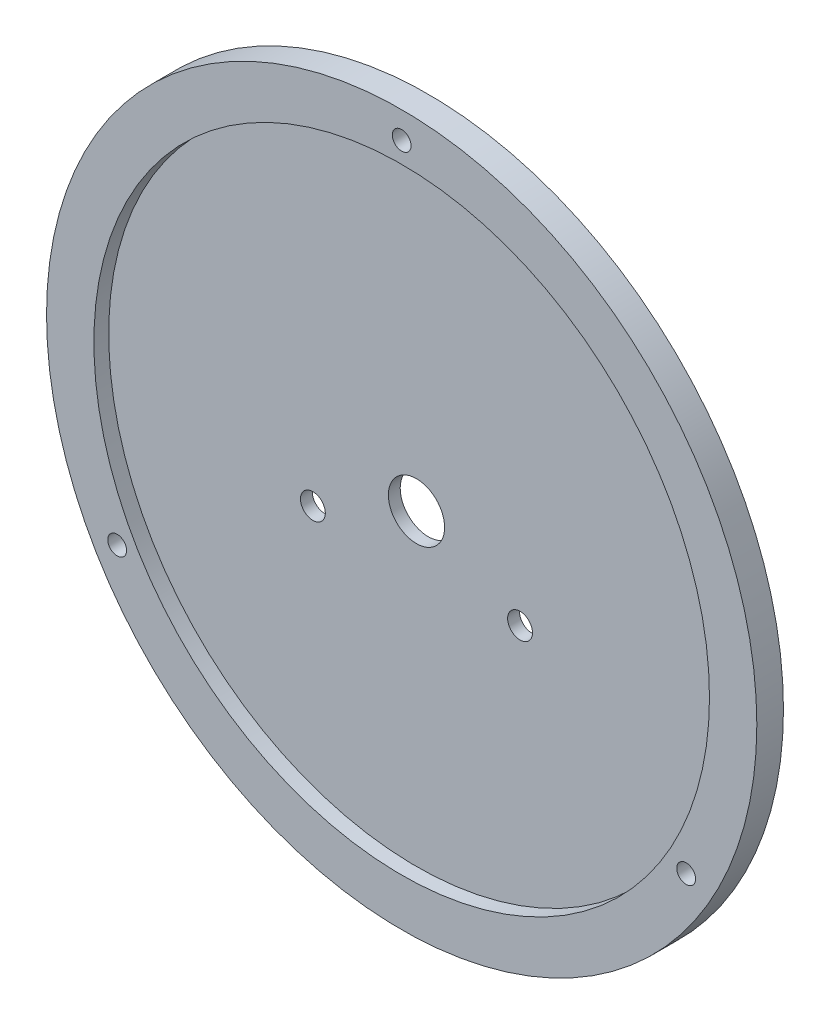
ISO-10303-21;
HEADER;
FILE_DESCRIPTION(('STEP AP214'),'2;1');
FILE_NAME('part.step','',(''),(''),'','','');
FILE_SCHEMA(('AUTOMOTIVE_DESIGN { 1 0 10303 214 1 1 1 1 }'));
ENDSEC;
DATA;
#1=APPLICATION_CONTEXT('core data for automotive mechanical design processes');
#2=APPLICATION_PROTOCOL_DEFINITION('international standard','automotive_design',2000,#1);
#3=PRODUCT_CONTEXT('',#1,'mechanical');
#4=PRODUCT('Part','Part','',(#3));
#5=PRODUCT_RELATED_PRODUCT_CATEGORY('part','',(#4));
#6=PRODUCT_DEFINITION_FORMATION('','',#4);
#7=PRODUCT_DEFINITION_CONTEXT('part definition',#1,'design');
#8=PRODUCT_DEFINITION('design','',#6,#7);
#9=PRODUCT_DEFINITION_SHAPE('','',#8);
#10=(LENGTH_UNIT() NAMED_UNIT(*) SI_UNIT(.MILLI.,.METRE.));
#11=(NAMED_UNIT(*) PLANE_ANGLE_UNIT() SI_UNIT($,.RADIAN.));
#12=(NAMED_UNIT(*) SI_UNIT($,.STERADIAN.) SOLID_ANGLE_UNIT());
#13=UNCERTAINTY_MEASURE_WITH_UNIT(LENGTH_MEASURE(1.E-05),#10,'distance_accuracy_value','');
#14=(GEOMETRIC_REPRESENTATION_CONTEXT(3) GLOBAL_UNCERTAINTY_ASSIGNED_CONTEXT((#13)) GLOBAL_UNIT_ASSIGNED_CONTEXT((#10,
#11,#12)) REPRESENTATION_CONTEXT('',''));
#15=CARTESIAN_POINT('',(0.,0.,0.));
#16=DIRECTION('',(0.,0.,1.));
#17=DIRECTION('',(1.,0.,0.));
#18=AXIS2_PLACEMENT_3D('',#15,#16,#17);
#19=CARTESIAN_POINT('',(0.,0.,2.));
#20=DIRECTION('',(0.,0.,-1.));
#21=DIRECTION('',(-1.,0.,0.));
#22=AXIS2_PLACEMENT_3D('',#19,#20,#21);
#23=CYLINDRICAL_SURFACE('',#22,60.);
#24=CARTESIAN_POINT('',(0.,0.,0.));
#25=DIRECTION('',(0.,0.,1.));
#26=DIRECTION('',(1.,0.,0.));
#27=AXIS2_PLACEMENT_3D('',#24,#25,#26);
#28=CIRCLE('',#27,60.);
#29=CARTESIAN_POINT('',(60.,0.,0.));
#30=VERTEX_POINT('',#29);
#31=EDGE_CURVE('E45',#30,#30,#28,.T.);
#32=ORIENTED_EDGE('',*,*,#31,.T.);
#33=EDGE_LOOP('',(#32));
#34=FACE_BOUND('',#33,.T.);
#35=CARTESIAN_POINT('',(0.,0.,4.5));
#36=DIRECTION('',(0.,0.,1.));
#37=DIRECTION('',(1.,0.,0.));
#38=AXIS2_PLACEMENT_3D('',#35,#36,#37);
#39=CIRCLE('',#38,60.);
#40=CARTESIAN_POINT('',(60.,0.,4.5));
#41=VERTEX_POINT('',#40);
#42=EDGE_CURVE('E51',#41,#41,#39,.T.);
#43=ORIENTED_EDGE('',*,*,#42,.F.);
#44=EDGE_LOOP('',(#43));
#45=FACE_BOUND('',#44,.T.);
#46=ADVANCED_FACE('F37',(#34,#45),#23,.T.);
#47=CARTESIAN_POINT('',(0.,0.,0.));
#48=DIRECTION('',(0.,0.,1.));
#49=DIRECTION('',(1.,0.,0.));
#50=AXIS2_PLACEMENT_3D('',#47,#48,#49);
#51=PLANE('',#50);
#52=CARTESIAN_POINT('',(17.5000000000001,-7.99999999999812,0.));
#53=DIRECTION('',(0.,0.,-1.));
#54=DIRECTION('',(-1.,0.,0.));
#55=AXIS2_PLACEMENT_3D('',#52,#53,#54);
#56=CIRCLE('',#55,2.1);
#57=CARTESIAN_POINT('',(15.4000000000001,-7.99999999999812,0.));
#58=VERTEX_POINT('',#57);
#59=EDGE_CURVE('E63',#58,#58,#56,.T.);
#60=ORIENTED_EDGE('',*,*,#59,.F.);
#61=EDGE_LOOP('',(#60));
#62=FACE_BOUND('',#61,.T.);
#63=CARTESIAN_POINT('',(-17.4999999999999,-7.99999999999812,0.));
#64=DIRECTION('',(0.,0.,-1.));
#65=DIRECTION('',(-1.,0.,0.));
#66=AXIS2_PLACEMENT_3D('',#63,#64,#65);
#67=CIRCLE('',#66,2.1);
#68=CARTESIAN_POINT('',(-19.5999999999999,-7.99999999999812,0.));
#69=VERTEX_POINT('',#68);
#70=EDGE_CURVE('E70',#69,#69,#67,.T.);
#71=ORIENTED_EDGE('',*,*,#70,.F.);
#72=EDGE_LOOP('',(#71));
#73=FACE_BOUND('',#72,.T.);
#74=CARTESIAN_POINT('',(0.,0.,0.));
#75=DIRECTION('',(0.,0.,-1.));
#76=DIRECTION('',(-1.,0.,0.));
#77=AXIS2_PLACEMENT_3D('',#74,#75,#76);
#78=CIRCLE('',#77,4.75);
#79=CARTESIAN_POINT('',(-4.75,0.,0.));
#80=VERTEX_POINT('',#79);
#81=EDGE_CURVE('E59',#80,#80,#78,.T.);
#82=ORIENTED_EDGE('',*,*,#81,.F.);
#83=EDGE_LOOP('',(#82));
#84=FACE_BOUND('',#83,.T.);
#85=CARTESIAN_POINT('',(0.,55.5,0.));
#86=DIRECTION('',(0.,0.,1.));
#87=DIRECTION('',(1.,0.,0.));
#88=AXIS2_PLACEMENT_3D('',#85,#86,#87);
#89=CIRCLE('',#88,1.5875);
#90=CARTESIAN_POINT('',(1.5875,55.5,0.));
#91=VERTEX_POINT('',#90);
#92=EDGE_CURVE('E81',#91,#91,#89,.T.);
#93=ORIENTED_EDGE('',*,*,#92,.T.);
#94=EDGE_LOOP('',(#93));
#95=FACE_BOUND('',#94,.T.);
#96=CARTESIAN_POINT('',(48.0644099100387,-27.7499999999986,0.));
#97=DIRECTION('',(0.,0.,1.));
#98=DIRECTION('',(1.,0.,0.));
#99=AXIS2_PLACEMENT_3D('',#96,#97,#98);
#100=CIRCLE('',#99,1.58750000000211);
#101=CARTESIAN_POINT('',(49.6519099100408,-27.7499999999986,0.));
#102=VERTEX_POINT('',#101);
#103=EDGE_CURVE('E90',#102,#102,#100,.T.);
#104=ORIENTED_EDGE('',*,*,#103,.T.);
#105=EDGE_LOOP('',(#104));
#106=FACE_BOUND('',#105,.T.);
#107=CARTESIAN_POINT('',(-48.064409910034,-27.7500000000014,0.));
#108=DIRECTION('',(0.,0.,1.));
#109=DIRECTION('',(1.,0.,0.));
#110=AXIS2_PLACEMENT_3D('',#107,#108,#109);
#111=CIRCLE('',#110,1.58750000000316);
#112=CARTESIAN_POINT('',(-46.4769099100308,-27.7500000000014,0.));
#113=VERTEX_POINT('',#112);
#114=EDGE_CURVE('E98',#113,#113,#111,.T.);
#115=ORIENTED_EDGE('',*,*,#114,.T.);
#116=EDGE_LOOP('',(#115));
#117=FACE_BOUND('',#116,.T.);
#118=ORIENTED_EDGE('',*,*,#31,.F.);
#119=EDGE_LOOP('',(#118));
#120=FACE_BOUND('',#119,.T.);
#121=ADVANCED_FACE('F115',(#62,#73,#84,#95,#106,#117,#120),#51,.F.);
#122=CARTESIAN_POINT('',(0.,0.,4.5));
#123=DIRECTION('',(0.,0.,1.));
#124=DIRECTION('',(1.,0.,0.));
#125=AXIS2_PLACEMENT_3D('',#122,#123,#124);
#126=PLANE('',#125);
#127=CARTESIAN_POINT('',(0.,55.5,4.5));
#128=DIRECTION('',(0.,0.,1.));
#129=DIRECTION('',(1.,0.,0.));
#130=AXIS2_PLACEMENT_3D('',#127,#128,#129);
#131=CIRCLE('',#130,1.5875);
#132=CARTESIAN_POINT('',(1.5875,55.5,4.5));
#133=VERTEX_POINT('',#132);
#134=EDGE_CURVE('E86',#133,#133,#131,.T.);
#135=ORIENTED_EDGE('',*,*,#134,.F.);
#136=EDGE_LOOP('',(#135));
#137=FACE_BOUND('',#136,.T.);
#138=CARTESIAN_POINT('',(48.0644099100387,-27.7499999999986,4.5));
#139=DIRECTION('',(0.,0.,1.));
#140=DIRECTION('',(1.,0.,0.));
#141=AXIS2_PLACEMENT_3D('',#138,#139,#140);
#142=CIRCLE('',#141,1.58750000000211);
#143=CARTESIAN_POINT('',(49.6519099100408,-27.7499999999986,4.5));
#144=VERTEX_POINT('',#143);
#145=EDGE_CURVE('E94',#144,#144,#142,.T.);
#146=ORIENTED_EDGE('',*,*,#145,.F.);
#147=EDGE_LOOP('',(#146));
#148=FACE_BOUND('',#147,.T.);
#149=CARTESIAN_POINT('',(-48.064409910034,-27.7500000000014,4.5));
#150=DIRECTION('',(0.,0.,1.));
#151=DIRECTION('',(1.,0.,0.));
#152=AXIS2_PLACEMENT_3D('',#149,#150,#151);
#153=CIRCLE('',#152,1.58750000000316);
#154=CARTESIAN_POINT('',(-46.4769099100308,-27.7500000000014,4.5));
#155=VERTEX_POINT('',#154);
#156=EDGE_CURVE('E58',#155,#155,#153,.T.);
#157=ORIENTED_EDGE('',*,*,#156,.F.);
#158=EDGE_LOOP('',(#157));
#159=FACE_BOUND('',#158,.T.);
#160=ORIENTED_EDGE('',*,*,#42,.T.);
#161=EDGE_LOOP('',(#160));
#162=FACE_BOUND('',#161,.T.);
#163=CARTESIAN_POINT('',(0.,0.,4.5));
#164=DIRECTION('',(0.,0.,1.));
#165=DIRECTION('',(1.,0.,0.));
#166=AXIS2_PLACEMENT_3D('',#163,#164,#165);
#167=CIRCLE('',#166,52.);
#168=CARTESIAN_POINT('',(52.,0.,4.5));
#169=VERTEX_POINT('',#168);
#170=EDGE_CURVE('E85',#169,#169,#167,.T.);
#171=ORIENTED_EDGE('',*,*,#170,.F.);
#172=EDGE_LOOP('',(#171));
#173=FACE_BOUND('',#172,.T.);
#174=ADVANCED_FACE('F111',(#137,#148,#159,#162,#173),#126,.T.);
#175=CARTESIAN_POINT('',(0.,0.,4.5));
#176=DIRECTION('',(0.,0.,-1.));
#177=DIRECTION('',(-1.,0.,0.));
#178=AXIS2_PLACEMENT_3D('',#175,#176,#177);
#179=CYLINDRICAL_SURFACE('',#178,52.);
#180=ORIENTED_EDGE('',*,*,#170,.T.);
#181=EDGE_LOOP('',(#180));
#182=FACE_BOUND('',#181,.T.);
#183=CARTESIAN_POINT('',(0.,0.,2.));
#184=DIRECTION('',(0.,0.,1.));
#185=DIRECTION('',(1.,0.,0.));
#186=AXIS2_PLACEMENT_3D('',#183,#184,#185);
#187=CIRCLE('',#186,52.);
#188=CARTESIAN_POINT('',(52.,0.,2.));
#189=VERTEX_POINT('',#188);
#190=EDGE_CURVE('E10',#189,#189,#187,.F.);
#191=ORIENTED_EDGE('',*,*,#190,.T.);
#192=EDGE_LOOP('',(#191));
#193=FACE_BOUND('',#192,.T.);
#194=ADVANCED_FACE('F126',(#182,#193),#179,.F.);
#195=CARTESIAN_POINT('',(0.,0.,2.));
#196=DIRECTION('',(0.,0.,1.));
#197=DIRECTION('',(1.,0.,0.));
#198=AXIS2_PLACEMENT_3D('',#195,#196,#197);
#199=PLANE('',#198);
#200=CARTESIAN_POINT('',(17.5000000000001,-7.99999999999812,2.));
#201=DIRECTION('',(0.,0.,1.));
#202=DIRECTION('',(1.,0.,0.));
#203=AXIS2_PLACEMENT_3D('',#200,#201,#202);
#204=CIRCLE('',#203,2.1);
#205=CARTESIAN_POINT('',(19.6000000000001,-7.99999999999812,2.));
#206=VERTEX_POINT('',#205);
#207=EDGE_CURVE('E40',#206,#206,#204,.T.);
#208=ORIENTED_EDGE('',*,*,#207,.F.);
#209=EDGE_LOOP('',(#208));
#210=FACE_BOUND('',#209,.T.);
#211=CARTESIAN_POINT('',(-17.4999999999999,-7.99999999999812,2.));
#212=DIRECTION('',(0.,0.,1.));
#213=DIRECTION('',(1.,0.,0.));
#214=AXIS2_PLACEMENT_3D('',#211,#212,#213);
#215=CIRCLE('',#214,2.1);
#216=CARTESIAN_POINT('',(-15.3999999999999,-7.99999999999812,2.));
#217=VERTEX_POINT('',#216);
#218=EDGE_CURVE('E60',#217,#217,#215,.T.);
#219=ORIENTED_EDGE('',*,*,#218,.F.);
#220=EDGE_LOOP('',(#219));
#221=FACE_BOUND('',#220,.T.);
#222=CARTESIAN_POINT('',(0.,0.,2.));
#223=DIRECTION('',(0.,0.,1.));
#224=DIRECTION('',(1.,0.,0.));
#225=AXIS2_PLACEMENT_3D('',#222,#223,#224);
#226=CIRCLE('',#225,4.75);
#227=CARTESIAN_POINT('',(4.75,0.,2.));
#228=VERTEX_POINT('',#227);
#229=EDGE_CURVE('E55',#228,#228,#226,.T.);
#230=ORIENTED_EDGE('',*,*,#229,.F.);
#231=EDGE_LOOP('',(#230));
#232=FACE_BOUND('',#231,.T.);
#233=ORIENTED_EDGE('',*,*,#190,.F.);
#234=EDGE_LOOP('',(#233));
#235=FACE_BOUND('',#234,.T.);
#236=ADVANCED_FACE('F131',(#210,#221,#232,#235),#199,.T.);
#237=CARTESIAN_POINT('',(-48.064409910034,-27.7500000000014,0.));
#238=DIRECTION('',(0.,0.,1.));
#239=DIRECTION('',(1.,0.,0.));
#240=AXIS2_PLACEMENT_3D('',#237,#238,#239);
#241=CYLINDRICAL_SURFACE('',#240,1.58750000000316);
#242=ORIENTED_EDGE('',*,*,#114,.F.);
#243=EDGE_LOOP('',(#242));
#244=FACE_BOUND('',#243,.T.);
#245=ORIENTED_EDGE('',*,*,#156,.T.);
#246=EDGE_LOOP('',(#245));
#247=FACE_BOUND('',#246,.T.);
#248=ADVANCED_FACE('F133',(#244,#247),#241,.F.);
#249=CARTESIAN_POINT('',(48.0644099100387,-27.7499999999986,0.));
#250=DIRECTION('',(0.,0.,1.));
#251=DIRECTION('',(1.,0.,0.));
#252=AXIS2_PLACEMENT_3D('',#249,#250,#251);
#253=CYLINDRICAL_SURFACE('',#252,1.58750000000211);
#254=ORIENTED_EDGE('',*,*,#103,.F.);
#255=EDGE_LOOP('',(#254));
#256=FACE_BOUND('',#255,.T.);
#257=ORIENTED_EDGE('',*,*,#145,.T.);
#258=EDGE_LOOP('',(#257));
#259=FACE_BOUND('',#258,.T.);
#260=ADVANCED_FACE('F141',(#256,#259),#253,.F.);
#261=CARTESIAN_POINT('',(0.,55.5,0.));
#262=DIRECTION('',(0.,0.,1.));
#263=DIRECTION('',(1.,0.,0.));
#264=AXIS2_PLACEMENT_3D('',#261,#262,#263);
#265=CYLINDRICAL_SURFACE('',#264,1.5875);
#266=ORIENTED_EDGE('',*,*,#92,.F.);
#267=EDGE_LOOP('',(#266));
#268=FACE_BOUND('',#267,.T.);
#269=ORIENTED_EDGE('',*,*,#134,.T.);
#270=EDGE_LOOP('',(#269));
#271=FACE_BOUND('',#270,.T.);
#272=ADVANCED_FACE('F145',(#268,#271),#265,.F.);
#273=CARTESIAN_POINT('',(0.,0.,4.5));
#274=DIRECTION('',(0.,0.,-1.));
#275=DIRECTION('',(-1.,0.,0.));
#276=AXIS2_PLACEMENT_3D('',#273,#274,#275);
#277=CYLINDRICAL_SURFACE('',#276,4.75);
#278=ORIENTED_EDGE('',*,*,#229,.T.);
#279=EDGE_LOOP('',(#278));
#280=FACE_BOUND('',#279,.T.);
#281=ORIENTED_EDGE('',*,*,#81,.T.);
#282=EDGE_LOOP('',(#281));
#283=FACE_BOUND('',#282,.T.);
#284=ADVANCED_FACE('F149',(#280,#283),#277,.F.);
#285=CARTESIAN_POINT('',(-17.4999999999999,-7.99999999999812,4.5));
#286=DIRECTION('',(0.,0.,-1.));
#287=DIRECTION('',(-1.,0.,0.));
#288=AXIS2_PLACEMENT_3D('',#285,#286,#287);
#289=CYLINDRICAL_SURFACE('',#288,2.1);
#290=ORIENTED_EDGE('',*,*,#218,.T.);
#291=EDGE_LOOP('',(#290));
#292=FACE_BOUND('',#291,.T.);
#293=ORIENTED_EDGE('',*,*,#70,.T.);
#294=EDGE_LOOP('',(#293));
#295=FACE_BOUND('',#294,.T.);
#296=ADVANCED_FACE('F153',(#292,#295),#289,.F.);
#297=CARTESIAN_POINT('',(17.5000000000001,-7.99999999999812,4.5));
#298=DIRECTION('',(0.,0.,-1.));
#299=DIRECTION('',(-1.,0.,0.));
#300=AXIS2_PLACEMENT_3D('',#297,#298,#299);
#301=CYLINDRICAL_SURFACE('',#300,2.1);
#302=ORIENTED_EDGE('',*,*,#207,.T.);
#303=EDGE_LOOP('',(#302));
#304=FACE_BOUND('',#303,.T.);
#305=ORIENTED_EDGE('',*,*,#59,.T.);
#306=EDGE_LOOP('',(#305));
#307=FACE_BOUND('',#306,.T.);
#308=ADVANCED_FACE('F157',(#304,#307),#301,.F.);
#309=CLOSED_SHELL('',(#46,#121,#174,#194,#236,#248,#260,#272,#284,#296,#308));
#310=MANIFOLD_SOLID_BREP('B2',#309);
#311=ADVANCED_BREP_SHAPE_REPRESENTATION('',(#18,#310),#14);
#312=SHAPE_DEFINITION_REPRESENTATION(#9,#311);
ENDSEC;
END-ISO-10303-21;
